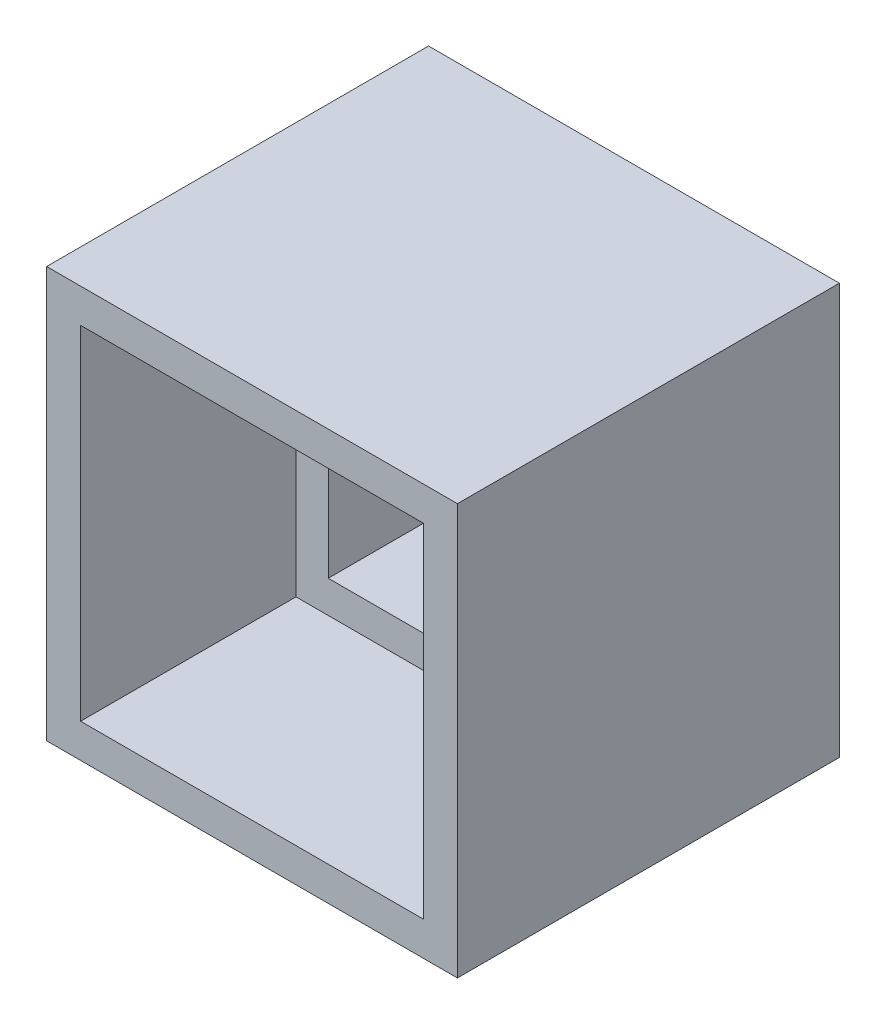
ISO-10303-21;
HEADER;
FILE_DESCRIPTION(('STEP AP214'),'2;1');
FILE_NAME('part.step','',(''),(''),'','','');
FILE_SCHEMA(('AUTOMOTIVE_DESIGN { 1 0 10303 214 1 1 1 1 }'));
ENDSEC;
DATA;
#1=APPLICATION_CONTEXT('core data for automotive mechanical design processes');
#2=APPLICATION_PROTOCOL_DEFINITION('international standard','automotive_design',2000,#1);
#3=PRODUCT_CONTEXT('',#1,'mechanical');
#4=PRODUCT('Part','Part','',(#3));
#5=PRODUCT_RELATED_PRODUCT_CATEGORY('part','',(#4));
#6=PRODUCT_DEFINITION_FORMATION('','',#4);
#7=PRODUCT_DEFINITION_CONTEXT('part definition',#1,'design');
#8=PRODUCT_DEFINITION('design','',#6,#7);
#9=PRODUCT_DEFINITION_SHAPE('','',#8);
#10=(LENGTH_UNIT() NAMED_UNIT(*) SI_UNIT(.MILLI.,.METRE.));
#11=(NAMED_UNIT(*) PLANE_ANGLE_UNIT() SI_UNIT($,.RADIAN.));
#12=(NAMED_UNIT(*) SI_UNIT($,.STERADIAN.) SOLID_ANGLE_UNIT());
#13=UNCERTAINTY_MEASURE_WITH_UNIT(LENGTH_MEASURE(1.E-05),#10,'distance_accuracy_value','');
#14=(GEOMETRIC_REPRESENTATION_CONTEXT(3) GLOBAL_UNCERTAINTY_ASSIGNED_CONTEXT((#13)) GLOBAL_UNIT_ASSIGNED_CONTEXT((#10,
#11,#12)) REPRESENTATION_CONTEXT('',''));
#15=CARTESIAN_POINT('',(0.,0.,0.));
#16=DIRECTION('',(0.,0.,1.));
#17=DIRECTION('',(1.,0.,0.));
#18=AXIS2_PLACEMENT_3D('',#15,#16,#17);
#19=CARTESIAN_POINT('',(0.,0.,50.8));
#20=DIRECTION('',(0.,0.,1.));
#21=DIRECTION('',(1.,0.,0.));
#22=AXIS2_PLACEMENT_3D('',#19,#20,#21);
#23=PLANE('',#22);
#24=DIRECTION('',(0.,1.,0.));
#25=VECTOR('',#24,1.);
#26=CARTESIAN_POINT('',(-25.654,-25.654,50.8));
#27=LINE('',#26,#25);
#28=CARTESIAN_POINT('',(-25.654,-25.654,50.8));
#29=VERTEX_POINT('',#28);
#30=CARTESIAN_POINT('',(-25.654,25.654,50.8));
#31=VERTEX_POINT('',#30);
#32=EDGE_CURVE('E150',#29,#31,#27,.T.);
#33=ORIENTED_EDGE('',*,*,#32,.T.);
#34=DIRECTION('',(1.,0.,0.));
#35=VECTOR('',#34,1.);
#36=CARTESIAN_POINT('',(-25.654,25.654,50.8));
#37=LINE('',#36,#35);
#38=CARTESIAN_POINT('',(25.654,25.654,50.8));
#39=VERTEX_POINT('',#38);
#40=EDGE_CURVE('E161',#31,#39,#37,.T.);
#41=ORIENTED_EDGE('',*,*,#40,.T.);
#42=DIRECTION('',(0.,-1.,0.));
#43=VECTOR('',#42,1.);
#44=CARTESIAN_POINT('',(25.654,25.654,50.8));
#45=LINE('',#44,#43);
#46=CARTESIAN_POINT('',(25.654,-25.654,50.8));
#47=VERTEX_POINT('',#46);
#48=EDGE_CURVE('E49',#39,#47,#45,.T.);
#49=ORIENTED_EDGE('',*,*,#48,.T.);
#50=DIRECTION('',(-1.,0.,0.));
#51=VECTOR('',#50,1.);
#52=CARTESIAN_POINT('',(25.654,-25.654,50.8));
#53=LINE('',#52,#51);
#54=EDGE_CURVE('E158',#47,#29,#53,.T.);
#55=ORIENTED_EDGE('',*,*,#54,.T.);
#56=EDGE_LOOP('',(#33,#41,#49,#55));
#57=FACE_BOUND('',#56,.T.);
#58=DIRECTION('',(0.,-1.,0.));
#59=VECTOR('',#58,1.);
#60=CARTESIAN_POINT('',(-30.734,30.734,50.8));
#61=LINE('',#60,#59);
#62=CARTESIAN_POINT('',(-30.734,30.734,50.8));
#63=VERTEX_POINT('',#62);
#64=CARTESIAN_POINT('',(-30.734,-30.734,50.8));
#65=VERTEX_POINT('',#64);
#66=EDGE_CURVE('E231',#63,#65,#61,.T.);
#67=ORIENTED_EDGE('',*,*,#66,.T.);
#68=DIRECTION('',(1.,0.,0.));
#69=VECTOR('',#68,1.);
#70=CARTESIAN_POINT('',(-30.734,-30.734,50.8));
#71=LINE('',#70,#69);
#72=CARTESIAN_POINT('',(30.734,-30.734,50.8));
#73=VERTEX_POINT('',#72);
#74=EDGE_CURVE('E234',#65,#73,#71,.T.);
#75=ORIENTED_EDGE('',*,*,#74,.T.);
#76=DIRECTION('',(0.,-1.,0.));
#77=VECTOR('',#76,1.);
#78=CARTESIAN_POINT('',(30.734,30.734,50.8));
#79=LINE('',#78,#77);
#80=CARTESIAN_POINT('',(30.734,30.734,50.8));
#81=VERTEX_POINT('',#80);
#82=EDGE_CURVE('E237',#81,#73,#79,.T.);
#83=ORIENTED_EDGE('',*,*,#82,.F.);
#84=DIRECTION('',(1.,0.,0.));
#85=VECTOR('',#84,1.);
#86=CARTESIAN_POINT('',(-30.734,30.734,50.8));
#87=LINE('',#86,#85);
#88=EDGE_CURVE('E240',#63,#81,#87,.T.);
#89=ORIENTED_EDGE('',*,*,#88,.F.);
#90=EDGE_LOOP('',(#67,#75,#83,#89));
#91=FACE_BOUND('',#90,.T.);
#92=ADVANCED_FACE('F34',(#57,#91),#23,.T.);
#93=CARTESIAN_POINT('',(-30.734,30.734,-6.35));
#94=DIRECTION('',(-1.,0.,0.));
#95=DIRECTION('',(0.,-1.,0.));
#96=AXIS2_PLACEMENT_3D('',#93,#94,#95);
#97=PLANE('',#96);
#98=DIRECTION('',(0.,0.,1.));
#99=VECTOR('',#98,1.);
#100=CARTESIAN_POINT('',(-30.734,-30.734,-6.35));
#101=LINE('',#100,#99);
#102=CARTESIAN_POINT('',(-30.734,-30.734,-6.35));
#103=VERTEX_POINT('',#102);
#104=EDGE_CURVE('E253',#103,#65,#101,.T.);
#105=ORIENTED_EDGE('',*,*,#104,.T.);
#106=ORIENTED_EDGE('',*,*,#66,.F.);
#107=DIRECTION('',(0.,0.,1.));
#108=VECTOR('',#107,1.);
#109=CARTESIAN_POINT('',(-30.734,30.734,-6.35));
#110=LINE('',#109,#108);
#111=CARTESIAN_POINT('',(-30.734,30.734,-6.35));
#112=VERTEX_POINT('',#111);
#113=EDGE_CURVE('E254',#112,#63,#110,.T.);
#114=ORIENTED_EDGE('',*,*,#113,.F.);
#115=DIRECTION('',(0.,-1.,0.));
#116=VECTOR('',#115,1.);
#117=CARTESIAN_POINT('',(-30.734,30.734,-6.35));
#118=LINE('',#117,#116);
#119=EDGE_CURVE('E243',#112,#103,#118,.T.);
#120=ORIENTED_EDGE('',*,*,#119,.T.);
#121=EDGE_LOOP('',(#105,#106,#114,#120));
#122=FACE_BOUND('',#121,.T.);
#123=ADVANCED_FACE('F36',(#122),#97,.T.);
#124=CARTESIAN_POINT('',(-30.734,30.734,-6.35));
#125=DIRECTION('',(0.,-1.,0.));
#126=DIRECTION('',(0.,0.,-1.));
#127=AXIS2_PLACEMENT_3D('',#124,#125,#126);
#128=PLANE('',#127);
#129=ORIENTED_EDGE('',*,*,#113,.T.);
#130=ORIENTED_EDGE('',*,*,#88,.T.);
#131=DIRECTION('',(0.,0.,1.));
#132=VECTOR('',#131,1.);
#133=CARTESIAN_POINT('',(30.734,30.734,-6.35));
#134=LINE('',#133,#132);
#135=CARTESIAN_POINT('',(30.734,30.734,-6.35));
#136=VERTEX_POINT('',#135);
#137=EDGE_CURVE('E257',#136,#81,#134,.T.);
#138=ORIENTED_EDGE('',*,*,#137,.F.);
#139=DIRECTION('',(1.,0.,0.));
#140=VECTOR('',#139,1.);
#141=CARTESIAN_POINT('',(-30.734,30.734,-6.35));
#142=LINE('',#141,#140);
#143=EDGE_CURVE('E251',#112,#136,#142,.T.);
#144=ORIENTED_EDGE('',*,*,#143,.F.);
#145=EDGE_LOOP('',(#129,#130,#138,#144));
#146=FACE_BOUND('',#145,.T.);
#147=ADVANCED_FACE('F307',(#146),#128,.F.);
#148=CARTESIAN_POINT('',(30.734,30.734,-6.35));
#149=DIRECTION('',(-1.,0.,0.));
#150=DIRECTION('',(0.,-1.,0.));
#151=AXIS2_PLACEMENT_3D('',#148,#149,#150);
#152=PLANE('',#151);
#153=ORIENTED_EDGE('',*,*,#137,.T.);
#154=ORIENTED_EDGE('',*,*,#82,.T.);
#155=DIRECTION('',(0.,0.,1.));
#156=VECTOR('',#155,1.);
#157=CARTESIAN_POINT('',(30.734,-30.734,-6.35));
#158=LINE('',#157,#156);
#159=CARTESIAN_POINT('',(30.734,-30.734,-6.35));
#160=VERTEX_POINT('',#159);
#161=EDGE_CURVE('E259',#160,#73,#158,.T.);
#162=ORIENTED_EDGE('',*,*,#161,.F.);
#163=DIRECTION('',(0.,-1.,0.));
#164=VECTOR('',#163,1.);
#165=CARTESIAN_POINT('',(30.734,30.734,-6.35));
#166=LINE('',#165,#164);
#167=EDGE_CURVE('E249',#136,#160,#166,.T.);
#168=ORIENTED_EDGE('',*,*,#167,.F.);
#169=EDGE_LOOP('',(#153,#154,#162,#168));
#170=FACE_BOUND('',#169,.T.);
#171=ADVANCED_FACE('F318',(#170),#152,.F.);
#172=CARTESIAN_POINT('',(-30.734,-30.734,-6.35));
#173=DIRECTION('',(0.,-1.,0.));
#174=DIRECTION('',(1.,0.,0.));
#175=AXIS2_PLACEMENT_3D('',#172,#173,#174);
#176=PLANE('',#175);
#177=ORIENTED_EDGE('',*,*,#161,.T.);
#178=ORIENTED_EDGE('',*,*,#74,.F.);
#179=ORIENTED_EDGE('',*,*,#104,.F.);
#180=DIRECTION('',(1.,0.,0.));
#181=VECTOR('',#180,1.);
#182=CARTESIAN_POINT('',(-30.734,-30.734,-6.35));
#183=LINE('',#182,#181);
#184=EDGE_CURVE('E246',#103,#160,#183,.T.);
#185=ORIENTED_EDGE('',*,*,#184,.T.);
#186=EDGE_LOOP('',(#177,#178,#179,#185));
#187=FACE_BOUND('',#186,.T.);
#188=ADVANCED_FACE('F315',(#187),#176,.T.);
#189=CARTESIAN_POINT('',(0.,0.,-6.35));
#190=DIRECTION('',(0.,0.,1.));
#191=DIRECTION('',(1.,0.,0.));
#192=AXIS2_PLACEMENT_3D('',#189,#190,#191);
#193=PLANE('',#192);
#194=DIRECTION('',(1.,0.,0.));
#195=VECTOR('',#194,1.);
#196=CARTESIAN_POINT('',(19.05,19.05,-6.35));
#197=LINE('',#196,#195);
#198=CARTESIAN_POINT('',(-19.05,19.05,-6.35));
#199=VERTEX_POINT('',#198);
#200=CARTESIAN_POINT('',(19.05,19.05,-6.35));
#201=VERTEX_POINT('',#200);
#202=EDGE_CURVE('E193',#199,#201,#197,.T.);
#203=ORIENTED_EDGE('',*,*,#202,.F.);
#204=DIRECTION('',(0.,1.,0.));
#205=VECTOR('',#204,1.);
#206=CARTESIAN_POINT('',(-19.05,19.05,-6.35));
#207=LINE('',#206,#205);
#208=CARTESIAN_POINT('',(-19.05,-19.05,-6.35));
#209=VERTEX_POINT('',#208);
#210=EDGE_CURVE('E191',#209,#199,#207,.T.);
#211=ORIENTED_EDGE('',*,*,#210,.F.);
#212=DIRECTION('',(-1.,0.,0.));
#213=VECTOR('',#212,1.);
#214=CARTESIAN_POINT('',(19.05,-19.05,-6.35));
#215=LINE('',#214,#213);
#216=CARTESIAN_POINT('',(19.05,-19.05,-6.35));
#217=VERTEX_POINT('',#216);
#218=EDGE_CURVE('E199',#217,#209,#215,.T.);
#219=ORIENTED_EDGE('',*,*,#218,.F.);
#220=DIRECTION('',(0.,-1.,0.));
#221=VECTOR('',#220,1.);
#222=CARTESIAN_POINT('',(19.05,19.05,-6.35));
#223=LINE('',#222,#221);
#224=EDGE_CURVE('E196',#201,#217,#223,.T.);
#225=ORIENTED_EDGE('',*,*,#224,.F.);
#226=EDGE_LOOP('',(#203,#211,#219,#225));
#227=FACE_BOUND('',#226,.T.);
#228=ORIENTED_EDGE('',*,*,#119,.F.);
#229=ORIENTED_EDGE('',*,*,#143,.T.);
#230=ORIENTED_EDGE('',*,*,#167,.T.);
#231=ORIENTED_EDGE('',*,*,#184,.F.);
#232=EDGE_LOOP('',(#228,#229,#230,#231));
#233=FACE_BOUND('',#232,.T.);
#234=ADVANCED_FACE('F288',(#227,#233),#193,.F.);
#235=CARTESIAN_POINT('',(-20.828,20.828,50.8));
#236=DIRECTION('',(1.,0.,0.));
#237=DIRECTION('',(0.,1.,0.));
#238=AXIS2_PLACEMENT_3D('',#235,#236,#237);
#239=PLANE('',#238);
#240=DIRECTION('',(0.,1.,0.));
#241=VECTOR('',#240,1.);
#242=CARTESIAN_POINT('',(-20.828,20.828,18.5674));
#243=LINE('',#242,#241);
#244=CARTESIAN_POINT('',(-20.828,-20.828,18.5674));
#245=VERTEX_POINT('',#244);
#246=CARTESIAN_POINT('',(-20.828,20.828,18.5674));
#247=VERTEX_POINT('',#246);
#248=EDGE_CURVE('E57',#245,#247,#243,.T.);
#249=ORIENTED_EDGE('',*,*,#248,.F.);
#250=DIRECTION('',(0.,0.,-1.));
#251=VECTOR('',#250,1.);
#252=CARTESIAN_POINT('',(-20.828,-20.828,50.8));
#253=LINE('',#252,#251);
#254=CARTESIAN_POINT('',(-20.828,-20.828,0.));
#255=VERTEX_POINT('',#254);
#256=EDGE_CURVE('E229',#245,#255,#253,.T.);
#257=ORIENTED_EDGE('',*,*,#256,.T.);
#258=DIRECTION('',(0.,-1.,0.));
#259=VECTOR('',#258,1.);
#260=CARTESIAN_POINT('',(-20.828,20.828,0.));
#261=LINE('',#260,#259);
#262=CARTESIAN_POINT('',(-20.828,20.828,0.));
#263=VERTEX_POINT('',#262);
#264=EDGE_CURVE('E205',#263,#255,#261,.T.);
#265=ORIENTED_EDGE('',*,*,#264,.F.);
#266=DIRECTION('',(0.,0.,-1.));
#267=VECTOR('',#266,1.);
#268=CARTESIAN_POINT('',(-20.828,20.828,50.8));
#269=LINE('',#268,#267);
#270=EDGE_CURVE('E223',#247,#263,#269,.T.);
#271=ORIENTED_EDGE('',*,*,#270,.F.);
#272=EDGE_LOOP('',(#249,#257,#265,#271));
#273=FACE_BOUND('',#272,.T.);
#274=ADVANCED_FACE('F311',(#273),#239,.T.);
#275=CARTESIAN_POINT('',(-20.828,-20.828,50.8));
#276=DIRECTION('',(0.,1.,0.));
#277=DIRECTION('',(0.,0.,1.));
#278=AXIS2_PLACEMENT_3D('',#275,#276,#277);
#279=PLANE('',#278);
#280=DIRECTION('',(-1.,0.,0.));
#281=VECTOR('',#280,1.);
#282=CARTESIAN_POINT('',(-20.828,-20.828,18.5674));
#283=LINE('',#282,#281);
#284=CARTESIAN_POINT('',(20.828,-20.828,18.5674));
#285=VERTEX_POINT('',#284);
#286=EDGE_CURVE('E188',#285,#245,#283,.T.);
#287=ORIENTED_EDGE('',*,*,#286,.F.);
#288=DIRECTION('',(0.,0.,-1.));
#289=VECTOR('',#288,1.);
#290=CARTESIAN_POINT('',(20.828,-20.828,50.8));
#291=LINE('',#290,#289);
#292=CARTESIAN_POINT('',(20.828,-20.828,0.));
#293=VERTEX_POINT('',#292);
#294=EDGE_CURVE('E227',#285,#293,#291,.T.);
#295=ORIENTED_EDGE('',*,*,#294,.T.);
#296=DIRECTION('',(1.,0.,0.));
#297=VECTOR('',#296,1.);
#298=CARTESIAN_POINT('',(-20.828,-20.828,0.));
#299=LINE('',#298,#297);
#300=EDGE_CURVE('E214',#255,#293,#299,.T.);
#301=ORIENTED_EDGE('',*,*,#300,.F.);
#302=ORIENTED_EDGE('',*,*,#256,.F.);
#303=EDGE_LOOP('',(#287,#295,#301,#302));
#304=FACE_BOUND('',#303,.T.);
#305=ADVANCED_FACE('F349',(#304),#279,.T.);
#306=CARTESIAN_POINT('',(20.828,20.828,50.8));
#307=DIRECTION('',(1.,0.,0.));
#308=DIRECTION('',(0.,1.,0.));
#309=AXIS2_PLACEMENT_3D('',#306,#307,#308);
#310=PLANE('',#309);
#311=ORIENTED_EDGE('',*,*,#294,.F.);
#312=DIRECTION('',(0.,1.,0.));
#313=VECTOR('',#312,1.);
#314=CARTESIAN_POINT('',(20.828,20.828,18.5674));
#315=LINE('',#314,#313);
#316=CARTESIAN_POINT('',(20.828,20.828,18.5674));
#317=VERTEX_POINT('',#316);
#318=EDGE_CURVE('E182',#285,#317,#315,.T.);
#319=ORIENTED_EDGE('',*,*,#318,.T.);
#320=DIRECTION('',(0.,0.,-1.));
#321=VECTOR('',#320,1.);
#322=CARTESIAN_POINT('',(20.828,20.828,50.8));
#323=LINE('',#322,#321);
#324=CARTESIAN_POINT('',(20.828,20.828,0.));
#325=VERTEX_POINT('',#324);
#326=EDGE_CURVE('E225',#317,#325,#323,.T.);
#327=ORIENTED_EDGE('',*,*,#326,.T.);
#328=DIRECTION('',(0.,-1.,0.));
#329=VECTOR('',#328,1.);
#330=CARTESIAN_POINT('',(20.828,20.828,0.));
#331=LINE('',#330,#329);
#332=EDGE_CURVE('E217',#325,#293,#331,.T.);
#333=ORIENTED_EDGE('',*,*,#332,.T.);
#334=EDGE_LOOP('',(#311,#319,#327,#333));
#335=FACE_BOUND('',#334,.T.);
#336=ADVANCED_FACE('F356',(#335),#310,.F.);
#337=CARTESIAN_POINT('',(-20.828,20.828,50.8));
#338=DIRECTION('',(0.,1.,0.));
#339=DIRECTION('',(0.,0.,1.));
#340=AXIS2_PLACEMENT_3D('',#337,#338,#339);
#341=PLANE('',#340);
#342=ORIENTED_EDGE('',*,*,#326,.F.);
#343=DIRECTION('',(-1.,0.,0.));
#344=VECTOR('',#343,1.);
#345=CARTESIAN_POINT('',(-20.828,20.828,18.5674));
#346=LINE('',#345,#344);
#347=EDGE_CURVE('E11',#317,#247,#346,.T.);
#348=ORIENTED_EDGE('',*,*,#347,.T.);
#349=ORIENTED_EDGE('',*,*,#270,.T.);
#350=DIRECTION('',(1.,0.,0.));
#351=VECTOR('',#350,1.);
#352=CARTESIAN_POINT('',(-20.828,20.828,0.));
#353=LINE('',#352,#351);
#354=EDGE_CURVE('E220',#263,#325,#353,.T.);
#355=ORIENTED_EDGE('',*,*,#354,.T.);
#356=EDGE_LOOP('',(#342,#348,#349,#355));
#357=FACE_BOUND('',#356,.T.);
#358=ADVANCED_FACE('F363',(#357),#341,.F.);
#359=CARTESIAN_POINT('',(0.,0.,0.));
#360=DIRECTION('',(0.,0.,1.));
#361=DIRECTION('',(1.,0.,0.));
#362=AXIS2_PLACEMENT_3D('',#359,#360,#361);
#363=PLANE('',#362);
#364=DIRECTION('',(0.,-1.,0.));
#365=VECTOR('',#364,1.);
#366=CARTESIAN_POINT('',(-19.05,0.,0.));
#367=LINE('',#366,#365);
#368=CARTESIAN_POINT('',(-19.05,19.05,0.));
#369=VERTEX_POINT('',#368);
#370=CARTESIAN_POINT('',(-19.05,-19.05,0.));
#371=VERTEX_POINT('',#370);
#372=EDGE_CURVE('E42',#369,#371,#367,.T.);
#373=ORIENTED_EDGE('',*,*,#372,.F.);
#374=DIRECTION('',(-1.,0.,0.));
#375=VECTOR('',#374,1.);
#376=CARTESIAN_POINT('',(0.,19.05,0.));
#377=LINE('',#376,#375);
#378=CARTESIAN_POINT('',(19.05,19.05,0.));
#379=VERTEX_POINT('',#378);
#380=EDGE_CURVE('E256',#379,#369,#377,.T.);
#381=ORIENTED_EDGE('',*,*,#380,.F.);
#382=DIRECTION('',(0.,1.,0.));
#383=VECTOR('',#382,1.);
#384=CARTESIAN_POINT('',(19.05,0.,0.));
#385=LINE('',#384,#383);
#386=CARTESIAN_POINT('',(19.05,-19.05,0.));
#387=VERTEX_POINT('',#386);
#388=EDGE_CURVE('E263',#387,#379,#385,.T.);
#389=ORIENTED_EDGE('',*,*,#388,.F.);
#390=DIRECTION('',(1.,0.,0.));
#391=VECTOR('',#390,1.);
#392=CARTESIAN_POINT('',(0.,-19.05,0.));
#393=LINE('',#392,#391);
#394=EDGE_CURVE('E266',#371,#387,#393,.T.);
#395=ORIENTED_EDGE('',*,*,#394,.F.);
#396=EDGE_LOOP('',(#373,#381,#389,#395));
#397=FACE_BOUND('',#396,.T.);
#398=ORIENTED_EDGE('',*,*,#264,.T.);
#399=ORIENTED_EDGE('',*,*,#300,.T.);
#400=ORIENTED_EDGE('',*,*,#332,.F.);
#401=ORIENTED_EDGE('',*,*,#354,.F.);
#402=EDGE_LOOP('',(#398,#399,#400,#401));
#403=FACE_BOUND('',#402,.T.);
#404=ADVANCED_FACE('F281',(#397,#403),#363,.T.);
#405=CARTESIAN_POINT('',(-19.05,19.05,50.8));
#406=DIRECTION('',(-1.,0.,0.));
#407=DIRECTION('',(0.,-1.,0.));
#408=AXIS2_PLACEMENT_3D('',#405,#406,#407);
#409=PLANE('',#408);
#410=ORIENTED_EDGE('',*,*,#372,.T.);
#411=DIRECTION('',(0.,0.,-1.));
#412=VECTOR('',#411,1.);
#413=CARTESIAN_POINT('',(-19.05,-19.05,50.8));
#414=LINE('',#413,#412);
#415=EDGE_CURVE('E203',#371,#209,#414,.T.);
#416=ORIENTED_EDGE('',*,*,#415,.T.);
#417=ORIENTED_EDGE('',*,*,#210,.T.);
#418=DIRECTION('',(0.,0.,-1.));
#419=VECTOR('',#418,1.);
#420=CARTESIAN_POINT('',(-19.05,19.05,50.8));
#421=LINE('',#420,#419);
#422=EDGE_CURVE('E202',#369,#199,#421,.T.);
#423=ORIENTED_EDGE('',*,*,#422,.F.);
#424=EDGE_LOOP('',(#410,#416,#417,#423));
#425=FACE_BOUND('',#424,.T.);
#426=ADVANCED_FACE('F271',(#425),#409,.F.);
#427=CARTESIAN_POINT('',(19.05,-19.05,50.8));
#428=DIRECTION('',(0.,-1.,0.));
#429=DIRECTION('',(0.,0.,-1.));
#430=AXIS2_PLACEMENT_3D('',#427,#428,#429);
#431=PLANE('',#430);
#432=ORIENTED_EDGE('',*,*,#394,.T.);
#433=DIRECTION('',(0.,0.,-1.));
#434=VECTOR('',#433,1.);
#435=CARTESIAN_POINT('',(19.05,-19.05,50.8));
#436=LINE('',#435,#434);
#437=EDGE_CURVE('E206',#387,#217,#436,.T.);
#438=ORIENTED_EDGE('',*,*,#437,.T.);
#439=ORIENTED_EDGE('',*,*,#218,.T.);
#440=ORIENTED_EDGE('',*,*,#415,.F.);
#441=EDGE_LOOP('',(#432,#438,#439,#440));
#442=FACE_BOUND('',#441,.T.);
#443=ADVANCED_FACE('F276',(#442),#431,.F.);
#444=CARTESIAN_POINT('',(19.05,19.05,50.8));
#445=DIRECTION('',(1.,0.,0.));
#446=DIRECTION('',(0.,1.,0.));
#447=AXIS2_PLACEMENT_3D('',#444,#445,#446);
#448=PLANE('',#447);
#449=ORIENTED_EDGE('',*,*,#388,.T.);
#450=DIRECTION('',(0.,0.,-1.));
#451=VECTOR('',#450,1.);
#452=CARTESIAN_POINT('',(19.05,19.05,50.8));
#453=LINE('',#452,#451);
#454=EDGE_CURVE('E208',#379,#201,#453,.T.);
#455=ORIENTED_EDGE('',*,*,#454,.T.);
#456=ORIENTED_EDGE('',*,*,#224,.T.);
#457=ORIENTED_EDGE('',*,*,#437,.F.);
#458=EDGE_LOOP('',(#449,#455,#456,#457));
#459=FACE_BOUND('',#458,.T.);
#460=ADVANCED_FACE('F284',(#459),#448,.F.);
#461=CARTESIAN_POINT('',(19.05,19.05,50.8));
#462=DIRECTION('',(0.,1.,0.));
#463=DIRECTION('',(0.,0.,1.));
#464=AXIS2_PLACEMENT_3D('',#461,#462,#463);
#465=PLANE('',#464);
#466=ORIENTED_EDGE('',*,*,#380,.T.);
#467=ORIENTED_EDGE('',*,*,#422,.T.);
#468=ORIENTED_EDGE('',*,*,#202,.T.);
#469=ORIENTED_EDGE('',*,*,#454,.F.);
#470=EDGE_LOOP('',(#466,#467,#468,#469));
#471=FACE_BOUND('',#470,.T.);
#472=ADVANCED_FACE('F291',(#471),#465,.F.);
#473=CARTESIAN_POINT('',(-25.654,-25.654,50.8));
#474=DIRECTION('',(-1.,0.,0.));
#475=DIRECTION('',(0.,0.,1.));
#476=AXIS2_PLACEMENT_3D('',#473,#474,#475);
#477=PLANE('',#476);
#478=DIRECTION('',(0.,1.,0.));
#479=VECTOR('',#478,1.);
#480=CARTESIAN_POINT('',(-25.654,-25.654,18.5674));
#481=LINE('',#480,#479);
#482=CARTESIAN_POINT('',(-25.654,-25.654,18.5674));
#483=VERTEX_POINT('',#482);
#484=CARTESIAN_POINT('',(-25.654,25.654,18.5674));
#485=VERTEX_POINT('',#484);
#486=EDGE_CURVE('E153',#483,#485,#481,.T.);
#487=ORIENTED_EDGE('',*,*,#486,.T.);
#488=DIRECTION('',(0.,0.,-1.));
#489=VECTOR('',#488,1.);
#490=CARTESIAN_POINT('',(-25.654,25.654,50.8));
#491=LINE('',#490,#489);
#492=EDGE_CURVE('E146',#31,#485,#491,.T.);
#493=ORIENTED_EDGE('',*,*,#492,.F.);
#494=ORIENTED_EDGE('',*,*,#32,.F.);
#495=DIRECTION('',(0.,0.,-1.));
#496=VECTOR('',#495,1.);
#497=CARTESIAN_POINT('',(-25.654,-25.654,50.8));
#498=LINE('',#497,#496);
#499=EDGE_CURVE('E180',#29,#483,#498,.T.);
#500=ORIENTED_EDGE('',*,*,#499,.T.);
#501=EDGE_LOOP('',(#487,#493,#494,#500));
#502=FACE_BOUND('',#501,.T.);
#503=ADVANCED_FACE('F148',(#502),#477,.F.);
#504=CARTESIAN_POINT('',(25.654,-25.654,50.8));
#505=DIRECTION('',(0.,-1.,0.));
#506=DIRECTION('',(0.,0.,-1.));
#507=AXIS2_PLACEMENT_3D('',#504,#505,#506);
#508=PLANE('',#507);
#509=DIRECTION('',(-1.,0.,0.));
#510=VECTOR('',#509,1.);
#511=CARTESIAN_POINT('',(25.654,-25.654,18.5674));
#512=LINE('',#511,#510);
#513=CARTESIAN_POINT('',(25.654,-25.654,18.5674));
#514=VERTEX_POINT('',#513);
#515=EDGE_CURVE('E167',#514,#483,#512,.T.);
#516=ORIENTED_EDGE('',*,*,#515,.T.);
#517=ORIENTED_EDGE('',*,*,#499,.F.);
#518=ORIENTED_EDGE('',*,*,#54,.F.);
#519=DIRECTION('',(0.,0.,-1.));
#520=VECTOR('',#519,1.);
#521=CARTESIAN_POINT('',(25.654,-25.654,50.8));
#522=LINE('',#521,#520);
#523=EDGE_CURVE('E183',#47,#514,#522,.T.);
#524=ORIENTED_EDGE('',*,*,#523,.T.);
#525=EDGE_LOOP('',(#516,#517,#518,#524));
#526=FACE_BOUND('',#525,.T.);
#527=ADVANCED_FACE('F298',(#526),#508,.F.);
#528=CARTESIAN_POINT('',(25.654,25.654,50.8));
#529=DIRECTION('',(1.,0.,0.));
#530=DIRECTION('',(0.,0.,-1.));
#531=AXIS2_PLACEMENT_3D('',#528,#529,#530);
#532=PLANE('',#531);
#533=DIRECTION('',(0.,-1.,0.));
#534=VECTOR('',#533,1.);
#535=CARTESIAN_POINT('',(25.654,25.654,18.5674));
#536=LINE('',#535,#534);
#537=CARTESIAN_POINT('',(25.654,25.654,18.5674));
#538=VERTEX_POINT('',#537);
#539=EDGE_CURVE('E170',#538,#514,#536,.T.);
#540=ORIENTED_EDGE('',*,*,#539,.T.);
#541=ORIENTED_EDGE('',*,*,#523,.F.);
#542=ORIENTED_EDGE('',*,*,#48,.F.);
#543=DIRECTION('',(0.,0.,-1.));
#544=VECTOR('',#543,1.);
#545=CARTESIAN_POINT('',(25.654,25.654,50.8));
#546=LINE('',#545,#544);
#547=EDGE_CURVE('E157',#39,#538,#546,.T.);
#548=ORIENTED_EDGE('',*,*,#547,.T.);
#549=EDGE_LOOP('',(#540,#541,#542,#548));
#550=FACE_BOUND('',#549,.T.);
#551=ADVANCED_FACE('F449',(#550),#532,.F.);
#552=CARTESIAN_POINT('',(-25.654,25.654,50.8));
#553=DIRECTION('',(0.,1.,0.));
#554=DIRECTION('',(0.,0.,1.));
#555=AXIS2_PLACEMENT_3D('',#552,#553,#554);
#556=PLANE('',#555);
#557=DIRECTION('',(1.,0.,0.));
#558=VECTOR('',#557,1.);
#559=CARTESIAN_POINT('',(-25.654,25.654,18.5674));
#560=LINE('',#559,#558);
#561=EDGE_CURVE('E176',#485,#538,#560,.T.);
#562=ORIENTED_EDGE('',*,*,#561,.T.);
#563=ORIENTED_EDGE('',*,*,#547,.F.);
#564=ORIENTED_EDGE('',*,*,#40,.F.);
#565=ORIENTED_EDGE('',*,*,#492,.T.);
#566=EDGE_LOOP('',(#562,#563,#564,#565));
#567=FACE_BOUND('',#566,.T.);
#568=ADVANCED_FACE('F162',(#567),#556,.F.);
#569=CARTESIAN_POINT('',(0.,0.,18.5674));
#570=DIRECTION('',(0.,0.,-1.));
#571=DIRECTION('',(-1.,0.,0.));
#572=AXIS2_PLACEMENT_3D('',#569,#570,#571);
#573=PLANE('',#572);
#574=ORIENTED_EDGE('',*,*,#248,.T.);
#575=ORIENTED_EDGE('',*,*,#347,.F.);
#576=ORIENTED_EDGE('',*,*,#318,.F.);
#577=ORIENTED_EDGE('',*,*,#286,.T.);
#578=EDGE_LOOP('',(#574,#575,#576,#577));
#579=FACE_BOUND('',#578,.T.);
#580=ORIENTED_EDGE('',*,*,#486,.F.);
#581=ORIENTED_EDGE('',*,*,#515,.F.);
#582=ORIENTED_EDGE('',*,*,#539,.F.);
#583=ORIENTED_EDGE('',*,*,#561,.F.);
#584=EDGE_LOOP('',(#580,#581,#582,#583));
#585=FACE_BOUND('',#584,.T.);
#586=ADVANCED_FACE('F465',(#579,#585),#573,.F.);
#587=CLOSED_SHELL('',(#92,#123,#147,#171,#188,#234,#274,#305,#336,#358,#404,#426,#443,#460,#472,
#503,#527,#551,#568,#586));
#588=MANIFOLD_SOLID_BREP('B2',#587);
#589=ADVANCED_BREP_SHAPE_REPRESENTATION('',(#18,#588),#14);
#590=SHAPE_DEFINITION_REPRESENTATION(#9,#589);
ENDSEC;
END-ISO-10303-21;
